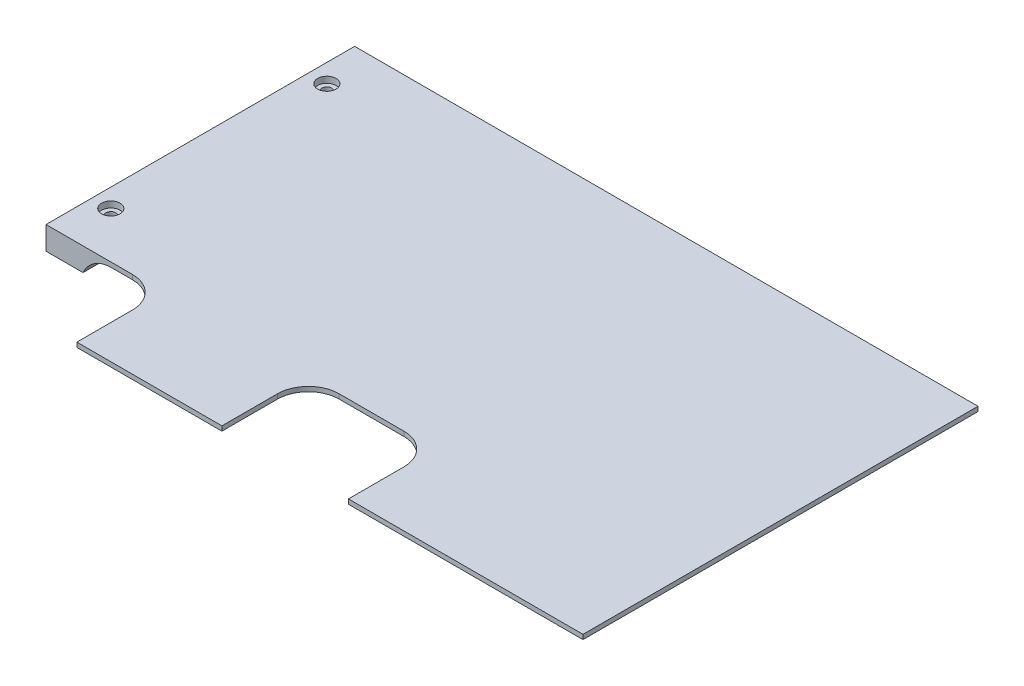
ISO-10303-21;
HEADER;
FILE_DESCRIPTION(('STEP AP214'),'2;1');
FILE_NAME('part.step','',(''),(''),'','','');
FILE_SCHEMA(('AUTOMOTIVE_DESIGN { 1 0 10303 214 1 1 1 1 }'));
ENDSEC;
DATA;
#1=APPLICATION_CONTEXT('core data for automotive mechanical design processes');
#2=APPLICATION_PROTOCOL_DEFINITION('international standard','automotive_design',2000,#1);
#3=PRODUCT_CONTEXT('',#1,'mechanical');
#4=PRODUCT('Part','Part','',(#3));
#5=PRODUCT_RELATED_PRODUCT_CATEGORY('part','',(#4));
#6=PRODUCT_DEFINITION_FORMATION('','',#4);
#7=PRODUCT_DEFINITION_CONTEXT('part definition',#1,'design');
#8=PRODUCT_DEFINITION('design','',#6,#7);
#9=PRODUCT_DEFINITION_SHAPE('','',#8);
#10=(LENGTH_UNIT() NAMED_UNIT(*) SI_UNIT(.MILLI.,.METRE.));
#11=(NAMED_UNIT(*) PLANE_ANGLE_UNIT() SI_UNIT($,.RADIAN.));
#12=(NAMED_UNIT(*) SI_UNIT($,.STERADIAN.) SOLID_ANGLE_UNIT());
#13=UNCERTAINTY_MEASURE_WITH_UNIT(LENGTH_MEASURE(1.E-05),#10,'distance_accuracy_value','');
#14=(GEOMETRIC_REPRESENTATION_CONTEXT(3) GLOBAL_UNCERTAINTY_ASSIGNED_CONTEXT((#13)) GLOBAL_UNIT_ASSIGNED_CONTEXT((#10,
#11,#12)) REPRESENTATION_CONTEXT('',''));
#15=CARTESIAN_POINT('',(0.,0.,0.));
#16=DIRECTION('',(0.,0.,1.));
#17=DIRECTION('',(1.,0.,0.));
#18=AXIS2_PLACEMENT_3D('',#15,#16,#17);
#19=CARTESIAN_POINT('',(5.99999999999995,-4.52548339959391,-15.));
#20=DIRECTION('',(0.,1.,0.));
#21=DIRECTION('',(0.,0.,1.));
#22=AXIS2_PLACEMENT_3D('',#19,#20,#21);
#23=CYLINDRICAL_SURFACE('',#22,1.6);
#24=CARTESIAN_POINT('',(5.99999999999995,-6.,-15.));
#25=DIRECTION('',(0.,-1.,0.));
#26=DIRECTION('',(0.,0.,-1.));
#27=AXIS2_PLACEMENT_3D('',#24,#25,#26);
#28=CIRCLE('',#27,1.6);
#29=CARTESIAN_POINT('',(5.99999999999995,-6.,-13.4));
#30=VERTEX_POINT('',#29);
#31=EDGE_CURVE('E204',#30,#30,#28,.T.);
#32=CARTESIAN_POINT('',(5.99999999999995,-0.5,-15.));
#33=DIRECTION('',(0.,1.,0.));
#34=DIRECTION('',(0.,0.,1.));
#35=AXIS2_PLACEMENT_3D('',#32,#33,#34);
#36=CIRCLE('',#35,1.6);
#37=CARTESIAN_POINT('',(5.99999999999995,-0.500000000000001,-13.4));
#38=VERTEX_POINT('',#37);
#39=EDGE_CURVE('E39',#38,#38,#36,.F.);
#40=CARTESIAN_POINT('',(5.99999999999995,-6.,-13.4));
#41=CARTESIAN_POINT('',(5.99999999999995,-5.94270833333333,-13.4));
#42=CARTESIAN_POINT('',(5.99999999999995,-5.88541666666667,-13.4));
#43=CARTESIAN_POINT('',(5.99999999999995,-5.77083333333333,-13.4));
#44=CARTESIAN_POINT('',(5.99999999999995,-5.71354166666667,-13.4));
#45=CARTESIAN_POINT('',(5.99999999999995,-5.59895833333333,-13.4));
#46=CARTESIAN_POINT('',(5.99999999999995,-5.54166666666667,-13.4));
#47=CARTESIAN_POINT('',(5.99999999999995,-5.42708333333333,-13.4));
#48=CARTESIAN_POINT('',(5.99999999999995,-5.36979166666667,-13.4));
#49=CARTESIAN_POINT('',(5.99999999999995,-5.25520833333333,-13.4));
#50=CARTESIAN_POINT('',(5.99999999999995,-5.19791666666667,-13.4));
#51=CARTESIAN_POINT('',(5.99999999999995,-5.08333333333333,-13.4));
#52=CARTESIAN_POINT('',(5.99999999999995,-5.02604166666667,-13.4));
#53=CARTESIAN_POINT('',(5.99999999999995,-4.91145833333333,-13.4));
#54=CARTESIAN_POINT('',(5.99999999999995,-4.85416666666667,-13.4));
#55=CARTESIAN_POINT('',(5.99999999999995,-4.73958333333333,-13.4));
#56=CARTESIAN_POINT('',(5.99999999999995,-4.68229166666667,-13.4));
#57=CARTESIAN_POINT('',(5.99999999999995,-4.56770833333333,-13.4));
#58=CARTESIAN_POINT('',(5.99999999999995,-4.51041666666667,-13.4));
#59=CARTESIAN_POINT('',(5.99999999999995,-4.39583333333333,-13.4));
#60=CARTESIAN_POINT('',(5.99999999999995,-4.33854166666667,-13.4));
#61=CARTESIAN_POINT('',(5.99999999999995,-4.22395833333333,-13.4));
#62=CARTESIAN_POINT('',(5.99999999999995,-4.16666666666667,-13.4));
#63=CARTESIAN_POINT('',(5.99999999999995,-4.05208333333333,-13.4));
#64=CARTESIAN_POINT('',(5.99999999999995,-3.99479166666667,-13.4));
#65=CARTESIAN_POINT('',(5.99999999999995,-3.88020833333333,-13.4));
#66=CARTESIAN_POINT('',(5.99999999999995,-3.82291666666667,-13.4));
#67=CARTESIAN_POINT('',(5.99999999999995,-3.70833333333333,-13.4));
#68=CARTESIAN_POINT('',(5.99999999999995,-3.65104166666667,-13.4));
#69=CARTESIAN_POINT('',(5.99999999999995,-3.53645833333333,-13.4));
#70=CARTESIAN_POINT('',(5.99999999999995,-3.47916666666667,-13.4));
#71=CARTESIAN_POINT('',(5.99999999999995,-3.36458333333333,-13.4));
#72=CARTESIAN_POINT('',(5.99999999999995,-3.30729166666667,-13.4));
#73=CARTESIAN_POINT('',(5.99999999999995,-3.19270833333333,-13.4));
#74=CARTESIAN_POINT('',(5.99999999999995,-3.13541666666667,-13.4));
#75=CARTESIAN_POINT('',(5.99999999999995,-3.02083333333333,-13.4));
#76=CARTESIAN_POINT('',(5.99999999999995,-2.96354166666667,-13.4));
#77=CARTESIAN_POINT('',(5.99999999999995,-2.84895833333333,-13.4));
#78=CARTESIAN_POINT('',(5.99999999999995,-2.79166666666667,-13.4));
#79=CARTESIAN_POINT('',(5.99999999999995,-2.67708333333333,-13.4));
#80=CARTESIAN_POINT('',(5.99999999999995,-2.61979166666667,-13.4));
#81=CARTESIAN_POINT('',(5.99999999999995,-2.50520833333333,-13.4));
#82=CARTESIAN_POINT('',(5.99999999999995,-2.44791666666667,-13.4));
#83=CARTESIAN_POINT('',(5.99999999999995,-2.33333333333333,-13.4));
#84=CARTESIAN_POINT('',(5.99999999999995,-2.27604166666667,-13.4));
#85=CARTESIAN_POINT('',(5.99999999999995,-2.16145833333333,-13.4));
#86=CARTESIAN_POINT('',(5.99999999999995,-2.10416666666667,-13.4));
#87=CARTESIAN_POINT('',(5.99999999999995,-1.98958333333333,-13.4));
#88=CARTESIAN_POINT('',(5.99999999999995,-1.93229166666667,-13.4));
#89=CARTESIAN_POINT('',(5.99999999999995,-1.81770833333333,-13.4));
#90=CARTESIAN_POINT('',(5.99999999999995,-1.76041666666667,-13.4));
#91=CARTESIAN_POINT('',(5.99999999999995,-1.64583333333333,-13.4));
#92=CARTESIAN_POINT('',(5.99999999999995,-1.58854166666667,-13.4));
#93=CARTESIAN_POINT('',(5.99999999999995,-1.47395833333333,-13.4));
#94=CARTESIAN_POINT('',(5.99999999999995,-1.41666666666667,-13.4));
#95=CARTESIAN_POINT('',(5.99999999999995,-1.30208333333333,-13.4));
#96=CARTESIAN_POINT('',(5.99999999999995,-1.24479166666667,-13.4));
#97=CARTESIAN_POINT('',(5.99999999999995,-1.13020833333333,-13.4));
#98=CARTESIAN_POINT('',(5.99999999999995,-1.07291666666667,-13.4));
#99=CARTESIAN_POINT('',(5.99999999999995,-0.958333333333334,-13.4));
#100=CARTESIAN_POINT('',(5.99999999999995,-0.901041666666667,-13.4));
#101=CARTESIAN_POINT('',(5.99999999999995,-0.786458333333334,-13.4));
#102=CARTESIAN_POINT('',(5.99999999999995,-0.729166666666667,-13.4));
#103=CARTESIAN_POINT('',(5.99999999999995,-0.614583333333334,-13.4));
#104=CARTESIAN_POINT('',(5.99999999999995,-0.557291666666668,-13.4));
#105=CARTESIAN_POINT('',(5.99999999999995,-0.500000000000001,-13.4));
#106=B_SPLINE_CURVE_WITH_KNOTS('',3,(#40,#41,#42,#43,#44,#45,#46,#47,#48,#49,#50,#51,#52,#53,
#54,#55,#56,#57,#58,#59,#60,#61,#62,#63,#64,#65,#66,#67,#68,#69,#70,#71,#72,#73,#74,#75,#76,#77,
#78,#79,#80,#81,#82,#83,#84,#85,#86,#87,#88,#89,#90,#91,#92,#93,#94,#95,#96,#97,#98,#99,#100,
#101,#102,#103,#104,#105),.UNSPECIFIED.,.F.,.F.,(4,2,2,2,2,2,2,2,2,2,2,2,2,2,2,2,2,2,2,2,2,2,2,
2,2,2,2,2,2,2,2,2,4),(0.,0.171874999999999,0.343749999999999,0.515625,0.6875,0.859375,1.03125,
1.203125,1.375,1.546875,1.71875,1.890625,2.0625,2.234375,2.40625,2.578125,2.75,2.921875,3.09375,
3.265625,3.4375,3.609375,3.78125,3.953125,4.125,4.296875,4.46875,4.640625,4.8125,4.984375,
5.15625,5.328125,5.5),.UNSPECIFIED.);
#107=EDGE_CURVE('BSEAM35',#30,#38,#106,.T.);
#108=ORIENTED_EDGE('',*,*,#31,.T.);
#109=ORIENTED_EDGE('',*,*,#39,.F.);
#110=ORIENTED_EDGE('',*,*,#107,.T.);
#111=ORIENTED_EDGE('',*,*,#107,.F.);
#112=EDGE_LOOP('',(#108,#110,#109,#111));
#113=FACE_BOUND('',#112,.T.);
#114=ADVANCED_FACE('F35',(#113),#23,.F.);
#115=CARTESIAN_POINT('',(5.99999999999995,-4.52548339959391,-85.));
#116=DIRECTION('',(0.,1.,0.));
#117=DIRECTION('',(0.,0.,1.));
#118=AXIS2_PLACEMENT_3D('',#115,#116,#117);
#119=CYLINDRICAL_SURFACE('',#118,1.6);
#120=CARTESIAN_POINT('',(5.99999999999995,-6.,-85.));
#121=DIRECTION('',(0.,-1.,0.));
#122=DIRECTION('',(0.,0.,-1.));
#123=AXIS2_PLACEMENT_3D('',#120,#121,#122);
#124=CIRCLE('',#123,1.60000000000001);
#125=CARTESIAN_POINT('',(5.99999999999995,-6.,-83.4));
#126=VERTEX_POINT('',#125);
#127=EDGE_CURVE('E201',#126,#126,#124,.T.);
#128=CARTESIAN_POINT('',(5.99999999999995,-0.5,-85.));
#129=DIRECTION('',(0.,1.,0.));
#130=DIRECTION('',(0.,0.,1.));
#131=AXIS2_PLACEMENT_3D('',#128,#129,#130);
#132=CIRCLE('',#131,1.6);
#133=CARTESIAN_POINT('',(5.99999999999995,-0.500000000000001,-83.4));
#134=VERTEX_POINT('',#133);
#135=EDGE_CURVE('E266',#134,#134,#132,.F.);
#136=CARTESIAN_POINT('',(5.99999999999995,-6.,-83.4));
#137=CARTESIAN_POINT('',(5.99999999999995,-5.94270833333333,-83.4));
#138=CARTESIAN_POINT('',(5.99999999999995,-5.88541666666667,-83.4));
#139=CARTESIAN_POINT('',(5.99999999999995,-5.77083333333333,-83.4));
#140=CARTESIAN_POINT('',(5.99999999999995,-5.71354166666667,-83.4));
#141=CARTESIAN_POINT('',(5.99999999999995,-5.59895833333333,-83.4));
#142=CARTESIAN_POINT('',(5.99999999999995,-5.54166666666667,-83.4));
#143=CARTESIAN_POINT('',(5.99999999999995,-5.42708333333333,-83.4));
#144=CARTESIAN_POINT('',(5.99999999999995,-5.36979166666667,-83.4));
#145=CARTESIAN_POINT('',(5.99999999999995,-5.25520833333333,-83.4));
#146=CARTESIAN_POINT('',(5.99999999999995,-5.19791666666667,-83.4));
#147=CARTESIAN_POINT('',(5.99999999999995,-5.08333333333333,-83.4));
#148=CARTESIAN_POINT('',(5.99999999999995,-5.02604166666667,-83.4));
#149=CARTESIAN_POINT('',(5.99999999999995,-4.91145833333333,-83.4));
#150=CARTESIAN_POINT('',(5.99999999999995,-4.85416666666667,-83.4));
#151=CARTESIAN_POINT('',(5.99999999999995,-4.73958333333333,-83.4));
#152=CARTESIAN_POINT('',(5.99999999999995,-4.68229166666667,-83.4));
#153=CARTESIAN_POINT('',(5.99999999999995,-4.56770833333333,-83.4));
#154=CARTESIAN_POINT('',(5.99999999999995,-4.51041666666667,-83.4));
#155=CARTESIAN_POINT('',(5.99999999999995,-4.39583333333333,-83.4));
#156=CARTESIAN_POINT('',(5.99999999999995,-4.33854166666667,-83.4));
#157=CARTESIAN_POINT('',(5.99999999999995,-4.22395833333333,-83.4));
#158=CARTESIAN_POINT('',(5.99999999999995,-4.16666666666667,-83.4));
#159=CARTESIAN_POINT('',(5.99999999999995,-4.05208333333333,-83.4));
#160=CARTESIAN_POINT('',(5.99999999999995,-3.99479166666667,-83.4));
#161=CARTESIAN_POINT('',(5.99999999999995,-3.88020833333333,-83.4));
#162=CARTESIAN_POINT('',(5.99999999999995,-3.82291666666667,-83.4));
#163=CARTESIAN_POINT('',(5.99999999999995,-3.70833333333333,-83.4));
#164=CARTESIAN_POINT('',(5.99999999999995,-3.65104166666667,-83.4));
#165=CARTESIAN_POINT('',(5.99999999999995,-3.53645833333333,-83.4));
#166=CARTESIAN_POINT('',(5.99999999999995,-3.47916666666667,-83.4));
#167=CARTESIAN_POINT('',(5.99999999999995,-3.36458333333333,-83.4));
#168=CARTESIAN_POINT('',(5.99999999999995,-3.30729166666667,-83.4));
#169=CARTESIAN_POINT('',(5.99999999999995,-3.19270833333333,-83.4));
#170=CARTESIAN_POINT('',(5.99999999999995,-3.13541666666667,-83.4));
#171=CARTESIAN_POINT('',(5.99999999999995,-3.02083333333333,-83.4));
#172=CARTESIAN_POINT('',(5.99999999999995,-2.96354166666667,-83.4));
#173=CARTESIAN_POINT('',(5.99999999999995,-2.84895833333333,-83.4));
#174=CARTESIAN_POINT('',(5.99999999999995,-2.79166666666667,-83.4));
#175=CARTESIAN_POINT('',(5.99999999999995,-2.67708333333333,-83.4));
#176=CARTESIAN_POINT('',(5.99999999999995,-2.61979166666667,-83.4));
#177=CARTESIAN_POINT('',(5.99999999999995,-2.50520833333333,-83.4));
#178=CARTESIAN_POINT('',(5.99999999999995,-2.44791666666667,-83.4));
#179=CARTESIAN_POINT('',(5.99999999999995,-2.33333333333333,-83.4));
#180=CARTESIAN_POINT('',(5.99999999999995,-2.27604166666667,-83.4));
#181=CARTESIAN_POINT('',(5.99999999999995,-2.16145833333333,-83.4));
#182=CARTESIAN_POINT('',(5.99999999999995,-2.10416666666667,-83.4));
#183=CARTESIAN_POINT('',(5.99999999999995,-1.98958333333333,-83.4));
#184=CARTESIAN_POINT('',(5.99999999999995,-1.93229166666667,-83.4));
#185=CARTESIAN_POINT('',(5.99999999999995,-1.81770833333333,-83.4));
#186=CARTESIAN_POINT('',(5.99999999999995,-1.76041666666667,-83.4));
#187=CARTESIAN_POINT('',(5.99999999999995,-1.64583333333333,-83.4));
#188=CARTESIAN_POINT('',(5.99999999999995,-1.58854166666667,-83.4));
#189=CARTESIAN_POINT('',(5.99999999999995,-1.47395833333333,-83.4));
#190=CARTESIAN_POINT('',(5.99999999999995,-1.41666666666667,-83.4));
#191=CARTESIAN_POINT('',(5.99999999999995,-1.30208333333333,-83.4));
#192=CARTESIAN_POINT('',(5.99999999999995,-1.24479166666667,-83.4));
#193=CARTESIAN_POINT('',(5.99999999999995,-1.13020833333333,-83.4));
#194=CARTESIAN_POINT('',(5.99999999999995,-1.07291666666667,-83.4));
#195=CARTESIAN_POINT('',(5.99999999999995,-0.958333333333334,-83.4));
#196=CARTESIAN_POINT('',(5.99999999999995,-0.901041666666667,-83.4));
#197=CARTESIAN_POINT('',(5.99999999999995,-0.786458333333334,-83.4));
#198=CARTESIAN_POINT('',(5.99999999999995,-0.729166666666667,-83.4));
#199=CARTESIAN_POINT('',(5.99999999999995,-0.614583333333334,-83.4));
#200=CARTESIAN_POINT('',(5.99999999999995,-0.557291666666668,-83.4));
#201=CARTESIAN_POINT('',(5.99999999999995,-0.500000000000001,-83.4));
#202=B_SPLINE_CURVE_WITH_KNOTS('',3,(#136,#137,#138,#139,#140,#141,#142,#143,#144,#145,#146,
#147,#148,#149,#150,#151,#152,#153,#154,#155,#156,#157,#158,#159,#160,#161,#162,#163,#164,#165,
#166,#167,#168,#169,#170,#171,#172,#173,#174,#175,#176,#177,#178,#179,#180,#181,#182,#183,#184,
#185,#186,#187,#188,#189,#190,#191,#192,#193,#194,#195,#196,#197,#198,#199,#200,#201),
.UNSPECIFIED.,.F.,.F.,(4,2,2,2,2,2,2,2,2,2,2,2,2,2,2,2,2,2,2,2,2,2,2,2,2,2,2,2,2,2,2,2,4),(0.,
0.171874999999999,0.343749999999999,0.515625,0.6875,0.859375,1.03125,1.203125,1.375,1.546875,
1.71875,1.890625,2.0625,2.234375,2.40625,2.578125,2.75,2.921875,3.09375,3.265625,3.4375,
3.609375,3.78125,3.953125,4.125,4.296875,4.46875,4.640625,4.8125,4.984375,5.15625,5.328125,5.5),.UNSPECIFIED.);
#203=EDGE_CURVE('BSEAM304',#126,#134,#202,.T.);
#204=ORIENTED_EDGE('',*,*,#127,.T.);
#205=ORIENTED_EDGE('',*,*,#135,.F.);
#206=ORIENTED_EDGE('',*,*,#203,.T.);
#207=ORIENTED_EDGE('',*,*,#203,.F.);
#208=EDGE_LOOP('',(#204,#206,#205,#207));
#209=FACE_BOUND('',#208,.T.);
#210=ADVANCED_FACE('F304',(#209),#119,.F.);
#211=CARTESIAN_POINT('',(0.,1.5,0.));
#212=DIRECTION('',(0.,0.,-1.));
#213=DIRECTION('',(-1.,0.,0.));
#214=AXIS2_PLACEMENT_3D('',#211,#212,#213);
#215=PLANE('',#214);
#216=DIRECTION('',(1.,0.,0.));
#217=VECTOR('',#216,1.);
#218=CARTESIAN_POINT('',(0.,1.5,0.));
#219=LINE('',#218,#217);
#220=CARTESIAN_POINT('',(94.9999999999999,1.5,0.));
#221=VERTEX_POINT('',#220);
#222=CARTESIAN_POINT('',(116.,1.5,0.));
#223=VERTEX_POINT('',#222);
#224=EDGE_CURVE('E222',#221,#223,#219,.T.);
#225=ORIENTED_EDGE('',*,*,#224,.F.);
#226=DIRECTION('',(0.,1.,0.));
#227=VECTOR('',#226,1.);
#228=CARTESIAN_POINT('',(94.9999999999999,1.5,0.));
#229=LINE('',#228,#227);
#230=CARTESIAN_POINT('',(94.9999999999999,0.,0.));
#231=VERTEX_POINT('',#230);
#232=EDGE_CURVE('E248',#221,#231,#229,.F.);
#233=ORIENTED_EDGE('',*,*,#232,.T.);
#234=DIRECTION('',(1.,0.,0.));
#235=VECTOR('',#234,1.);
#236=CARTESIAN_POINT('',(0.,0.,0.));
#237=LINE('',#236,#235);
#238=CARTESIAN_POINT('',(116.,0.,0.));
#239=VERTEX_POINT('',#238);
#240=EDGE_CURVE('E219',#231,#239,#237,.T.);
#241=ORIENTED_EDGE('',*,*,#240,.T.);
#242=DIRECTION('',(0.,1.,0.));
#243=VECTOR('',#242,1.);
#244=CARTESIAN_POINT('',(116.,1.5,0.));
#245=LINE('',#244,#243);
#246=EDGE_CURVE('E245',#239,#223,#245,.T.);
#247=ORIENTED_EDGE('',*,*,#246,.T.);
#248=EDGE_LOOP('',(#225,#233,#241,#247));
#249=FACE_BOUND('',#248,.T.);
#250=ADVANCED_FACE('F309',(#249),#215,.F.);
#251=CARTESIAN_POINT('',(0.,1.5,0.));
#252=DIRECTION('',(1.,0.,0.));
#253=DIRECTION('',(0.,0.,-1.));
#254=AXIS2_PLACEMENT_3D('',#251,#252,#253);
#255=PLANE('',#254);
#256=DIRECTION('',(0.,-1.,0.));
#257=VECTOR('',#256,1.);
#258=CARTESIAN_POINT('',(0.,1.5,-100.));
#259=LINE('',#258,#257);
#260=CARTESIAN_POINT('',(0.,1.5,-100.));
#261=VERTEX_POINT('',#260);
#262=CARTESIAN_POINT('',(0.,-6.,-100.));
#263=VERTEX_POINT('',#262);
#264=EDGE_CURVE('E227',#261,#263,#259,.T.);
#265=ORIENTED_EDGE('',*,*,#264,.T.);
#266=DIRECTION('',(0.,0.,-1.));
#267=VECTOR('',#266,1.);
#268=CARTESIAN_POINT('',(0.,-6.,-100.));
#269=LINE('',#268,#267);
#270=CARTESIAN_POINT('',(0.,-6.,0.));
#271=VERTEX_POINT('',#270);
#272=EDGE_CURVE('E207',#271,#263,#269,.T.);
#273=ORIENTED_EDGE('',*,*,#272,.F.);
#274=DIRECTION('',(0.,-1.,0.));
#275=VECTOR('',#274,1.);
#276=CARTESIAN_POINT('',(0.,1.5,0.));
#277=LINE('',#276,#275);
#278=CARTESIAN_POINT('',(0.,1.5,0.));
#279=VERTEX_POINT('',#278);
#280=EDGE_CURVE('E235',#279,#271,#277,.T.);
#281=ORIENTED_EDGE('',*,*,#280,.F.);
#282=DIRECTION('',(0.,0.,1.));
#283=VECTOR('',#282,1.);
#284=CARTESIAN_POINT('',(0.,1.5,0.));
#285=LINE('',#284,#283);
#286=EDGE_CURVE('E220',#261,#279,#285,.T.);
#287=ORIENTED_EDGE('',*,*,#286,.F.);
#288=EDGE_LOOP('',(#265,#273,#281,#287));
#289=FACE_BOUND('',#288,.T.);
#290=ADVANCED_FACE('F366',(#289),#255,.F.);
#291=DIRECTION('',(-1.,0.,0.));
#292=VECTOR('',#291,1.);
#293=CARTESIAN_POINT('',(0.,-6.,0.));
#294=LINE('',#293,#292);
#295=CARTESIAN_POINT('',(11.9999999999999,-6.,0.));
#296=VERTEX_POINT('',#295);
#297=EDGE_CURVE('E216',#296,#271,#294,.T.);
#298=ORIENTED_EDGE('',*,*,#297,.F.);
#299=CARTESIAN_POINT('',(21.1651513899116,-10.,0.));
#300=DIRECTION('',(0.,0.,-1.));
#301=DIRECTION('',(-1.,0.,0.));
#302=AXIS2_PLACEMENT_3D('',#299,#300,#301);
#303=CIRCLE('',#302,10.);
#304=CARTESIAN_POINT('',(21.1651513899116,0.,0.));
#305=VERTEX_POINT('',#304);
#306=EDGE_CURVE('E44',#296,#305,#303,.T.);
#307=ORIENTED_EDGE('',*,*,#306,.T.);
#308=CARTESIAN_POINT('',(27.9999999999999,0.,0.));
#309=VERTEX_POINT('',#308);
#310=EDGE_CURVE('E228',#305,#309,#237,.T.);
#311=ORIENTED_EDGE('',*,*,#310,.T.);
#312=DIRECTION('',(0.,1.,0.));
#313=VECTOR('',#312,1.);
#314=CARTESIAN_POINT('',(27.9999999999999,1.5,0.));
#315=LINE('',#314,#313);
#316=CARTESIAN_POINT('',(27.9999999999999,1.5,0.));
#317=VERTEX_POINT('',#316);
#318=EDGE_CURVE('E237',#309,#317,#315,.T.);
#319=ORIENTED_EDGE('',*,*,#318,.T.);
#320=EDGE_CURVE('E154',#279,#317,#219,.T.);
#321=ORIENTED_EDGE('',*,*,#320,.F.);
#322=ORIENTED_EDGE('',*,*,#280,.T.);
#323=EDGE_LOOP('',(#298,#307,#311,#319,#321,#322));
#324=FACE_BOUND('',#323,.T.);
#325=ADVANCED_FACE('F369',(#324),#215,.F.);
#326=CARTESIAN_POINT('',(202.,1.5,0.));
#327=DIRECTION('',(-1.,0.,0.));
#328=DIRECTION('',(0.,0.,1.));
#329=AXIS2_PLACEMENT_3D('',#326,#327,#328);
#330=PLANE('',#329);
#331=DIRECTION('',(0.,0.,-1.));
#332=VECTOR('',#331,1.);
#333=CARTESIAN_POINT('',(202.,0.,0.));
#334=LINE('',#333,#332);
#335=CARTESIAN_POINT('',(202.,0.,28.));
#336=VERTEX_POINT('',#335);
#337=CARTESIAN_POINT('',(202.,0.,-100.));
#338=VERTEX_POINT('',#337);
#339=EDGE_CURVE('E230',#336,#338,#334,.T.);
#340=ORIENTED_EDGE('',*,*,#339,.T.);
#341=DIRECTION('',(0.,-1.,0.));
#342=VECTOR('',#341,1.);
#343=CARTESIAN_POINT('',(202.,1.5,-100.));
#344=LINE('',#343,#342);
#345=CARTESIAN_POINT('',(202.,1.5,-100.));
#346=VERTEX_POINT('',#345);
#347=EDGE_CURVE('E149',#346,#338,#344,.T.);
#348=ORIENTED_EDGE('',*,*,#347,.F.);
#349=DIRECTION('',(0.,0.,-1.));
#350=VECTOR('',#349,1.);
#351=CARTESIAN_POINT('',(202.,1.5,0.));
#352=LINE('',#351,#350);
#353=CARTESIAN_POINT('',(202.,1.5,28.));
#354=VERTEX_POINT('',#353);
#355=EDGE_CURVE('E143',#354,#346,#352,.T.);
#356=ORIENTED_EDGE('',*,*,#355,.F.);
#357=DIRECTION('',(0.,1.,0.));
#358=VECTOR('',#357,1.);
#359=CARTESIAN_POINT('',(202.,-80.9938269252663,28.));
#360=LINE('',#359,#358);
#361=EDGE_CURVE('E146',#336,#354,#360,.T.);
#362=ORIENTED_EDGE('',*,*,#361,.F.);
#363=EDGE_LOOP('',(#340,#348,#356,#362));
#364=FACE_BOUND('',#363,.T.);
#365=ADVANCED_FACE('F145',(#364),#330,.F.);
#366=CARTESIAN_POINT('',(0.,1.5,-100.));
#367=DIRECTION('',(0.,0.,1.));
#368=DIRECTION('',(1.,0.,0.));
#369=AXIS2_PLACEMENT_3D('',#366,#367,#368);
#370=PLANE('',#369);
#371=DIRECTION('',(-1.,0.,0.));
#372=VECTOR('',#371,1.);
#373=CARTESIAN_POINT('',(0.,0.,-100.));
#374=LINE('',#373,#372);
#375=CARTESIAN_POINT('',(21.1651513899116,0.,-100.));
#376=VERTEX_POINT('',#375);
#377=EDGE_CURVE('E223',#338,#376,#374,.T.);
#378=ORIENTED_EDGE('',*,*,#377,.T.);
#379=CARTESIAN_POINT('',(21.1651513899116,-10.,-100.));
#380=DIRECTION('',(0.,0.,1.));
#381=DIRECTION('',(1.,0.,0.));
#382=AXIS2_PLACEMENT_3D('',#379,#380,#381);
#383=CIRCLE('',#382,10.);
#384=CARTESIAN_POINT('',(11.9999999999999,-6.,-100.));
#385=VERTEX_POINT('',#384);
#386=EDGE_CURVE('E11',#376,#385,#383,.T.);
#387=ORIENTED_EDGE('',*,*,#386,.T.);
#388=DIRECTION('',(1.,0.,0.));
#389=VECTOR('',#388,1.);
#390=CARTESIAN_POINT('',(0.,-6.,-100.));
#391=LINE('',#390,#389);
#392=EDGE_CURVE('E210',#263,#385,#391,.T.);
#393=ORIENTED_EDGE('',*,*,#392,.F.);
#394=ORIENTED_EDGE('',*,*,#264,.F.);
#395=DIRECTION('',(-1.,0.,0.));
#396=VECTOR('',#395,1.);
#397=CARTESIAN_POINT('',(0.,1.5,-100.));
#398=LINE('',#397,#396);
#399=EDGE_CURVE('E153',#346,#261,#398,.T.);
#400=ORIENTED_EDGE('',*,*,#399,.F.);
#401=ORIENTED_EDGE('',*,*,#347,.T.);
#402=EDGE_LOOP('',(#378,#387,#393,#394,#400,#401));
#403=FACE_BOUND('',#402,.T.);
#404=ADVANCED_FACE('F290',(#403),#370,.F.);
#405=CARTESIAN_POINT('',(0.,1.5,0.));
#406=DIRECTION('',(0.,-1.,0.));
#407=DIRECTION('',(0.,0.,-1.));
#408=AXIS2_PLACEMENT_3D('',#405,#406,#407);
#409=PLANE('',#408);
#410=CARTESIAN_POINT('',(5.99999999999995,1.5,-85.));
#411=DIRECTION('',(0.,1.,0.));
#412=DIRECTION('',(0.,0.,1.));
#413=AXIS2_PLACEMENT_3D('',#410,#411,#412);
#414=CIRCLE('',#413,3.);
#415=CARTESIAN_POINT('',(5.99999999999995,1.5,-82.));
#416=VERTEX_POINT('',#415);
#417=EDGE_CURVE('E273',#416,#416,#414,.T.);
#418=ORIENTED_EDGE('',*,*,#417,.F.);
#419=EDGE_LOOP('',(#418));
#420=FACE_BOUND('',#419,.T.);
#421=CARTESIAN_POINT('',(5.99999999999995,1.5,-15.));
#422=DIRECTION('',(0.,1.,0.));
#423=DIRECTION('',(0.,0.,1.));
#424=AXIS2_PLACEMENT_3D('',#421,#422,#423);
#425=CIRCLE('',#424,3.);
#426=CARTESIAN_POINT('',(5.99999999999995,1.5,-12.));
#427=VERTEX_POINT('',#426);
#428=EDGE_CURVE('E176',#427,#427,#425,.T.);
#429=ORIENTED_EDGE('',*,*,#428,.F.);
#430=EDGE_LOOP('',(#429));
#431=FACE_BOUND('',#430,.T.);
#432=ORIENTED_EDGE('',*,*,#286,.T.);
#433=ORIENTED_EDGE('',*,*,#320,.T.);
#434=CARTESIAN_POINT('',(27.9999999999999,1.5,10.));
#435=DIRECTION('',(0.,-1.,0.));
#436=DIRECTION('',(0.,0.,-1.));
#437=AXIS2_PLACEMENT_3D('',#434,#435,#436);
#438=CIRCLE('',#437,10.);
#439=CARTESIAN_POINT('',(37.9999999999999,1.5,10.));
#440=VERTEX_POINT('',#439);
#441=EDGE_CURVE('E252',#317,#440,#438,.T.);
#442=ORIENTED_EDGE('',*,*,#441,.T.);
#443=DIRECTION('',(0.,0.,1.));
#444=VECTOR('',#443,1.);
#445=CARTESIAN_POINT('',(37.9999999999999,1.5,0.));
#446=LINE('',#445,#444);
#447=CARTESIAN_POINT('',(37.9999999999999,1.5,28.));
#448=VERTEX_POINT('',#447);
#449=EDGE_CURVE('E163',#440,#448,#446,.T.);
#450=ORIENTED_EDGE('',*,*,#449,.T.);
#451=DIRECTION('',(1.,0.,0.));
#452=VECTOR('',#451,1.);
#453=CARTESIAN_POINT('',(37.9999999999999,1.5,28.));
#454=LINE('',#453,#452);
#455=CARTESIAN_POINT('',(84.9999999999999,1.5,28.));
#456=VERTEX_POINT('',#455);
#457=EDGE_CURVE('E185',#448,#456,#454,.T.);
#458=ORIENTED_EDGE('',*,*,#457,.T.);
#459=DIRECTION('',(0.,0.,-1.));
#460=VECTOR('',#459,1.);
#461=CARTESIAN_POINT('',(84.9999999999999,1.5,0.));
#462=LINE('',#461,#460);
#463=CARTESIAN_POINT('',(84.9999999999999,1.5,10.));
#464=VERTEX_POINT('',#463);
#465=EDGE_CURVE('E181',#456,#464,#462,.T.);
#466=ORIENTED_EDGE('',*,*,#465,.T.);
#467=CARTESIAN_POINT('',(94.9999999999999,1.5,10.));
#468=DIRECTION('',(0.,-1.,0.));
#469=DIRECTION('',(0.,0.,-1.));
#470=AXIS2_PLACEMENT_3D('',#467,#468,#469);
#471=CIRCLE('',#470,10.);
#472=EDGE_CURVE('E257',#464,#221,#471,.T.);
#473=ORIENTED_EDGE('',*,*,#472,.T.);
#474=ORIENTED_EDGE('',*,*,#224,.T.);
#475=CARTESIAN_POINT('',(116.,1.5,10.));
#476=DIRECTION('',(0.,-1.,0.));
#477=DIRECTION('',(0.,0.,-1.));
#478=AXIS2_PLACEMENT_3D('',#475,#476,#477);
#479=CIRCLE('',#478,10.);
#480=CARTESIAN_POINT('',(126.,1.5,10.));
#481=VERTEX_POINT('',#480);
#482=EDGE_CURVE('E261',#223,#481,#479,.T.);
#483=ORIENTED_EDGE('',*,*,#482,.T.);
#484=DIRECTION('',(0.,0.,1.));
#485=VECTOR('',#484,1.);
#486=CARTESIAN_POINT('',(126.,1.5,0.));
#487=LINE('',#486,#485);
#488=CARTESIAN_POINT('',(126.,1.5,28.));
#489=VERTEX_POINT('',#488);
#490=EDGE_CURVE('E168',#481,#489,#487,.T.);
#491=ORIENTED_EDGE('',*,*,#490,.T.);
#492=DIRECTION('',(1.,0.,0.));
#493=VECTOR('',#492,1.);
#494=CARTESIAN_POINT('',(202.,1.5,28.));
#495=LINE('',#494,#493);
#496=EDGE_CURVE('E160',#489,#354,#495,.T.);
#497=ORIENTED_EDGE('',*,*,#496,.T.);
#498=ORIENTED_EDGE('',*,*,#355,.T.);
#499=ORIENTED_EDGE('',*,*,#399,.T.);
#500=EDGE_LOOP('',(#432,#433,#442,#450,#458,#466,#473,#474,#483,#491,#497,#498,#499));
#501=FACE_BOUND('',#500,.T.);
#502=ADVANCED_FACE('F166',(#420,#431,#501),#409,.F.);
#503=CARTESIAN_POINT('',(0.,0.,0.));
#504=DIRECTION('',(0.,-1.,0.));
#505=DIRECTION('',(0.,0.,-1.));
#506=AXIS2_PLACEMENT_3D('',#503,#504,#505);
#507=PLANE('',#506);
#508=ORIENTED_EDGE('',*,*,#310,.F.);
#509=DIRECTION('',(0.,0.,1.));
#510=VECTOR('',#509,1.);
#511=CARTESIAN_POINT('',(21.1651513899116,0.,-100.));
#512=LINE('',#511,#510);
#513=EDGE_CURVE('E58',#305,#376,#512,.F.);
#514=ORIENTED_EDGE('',*,*,#513,.T.);
#515=ORIENTED_EDGE('',*,*,#377,.F.);
#516=ORIENTED_EDGE('',*,*,#339,.F.);
#517=DIRECTION('',(1.,0.,0.));
#518=VECTOR('',#517,1.);
#519=CARTESIAN_POINT('',(202.,0.,28.));
#520=LINE('',#519,#518);
#521=CARTESIAN_POINT('',(126.,0.,28.));
#522=VERTEX_POINT('',#521);
#523=EDGE_CURVE('E162',#522,#336,#520,.T.);
#524=ORIENTED_EDGE('',*,*,#523,.F.);
#525=DIRECTION('',(0.,0.,1.));
#526=VECTOR('',#525,1.);
#527=CARTESIAN_POINT('',(126.,0.,0.));
#528=LINE('',#527,#526);
#529=CARTESIAN_POINT('',(126.,0.,10.));
#530=VERTEX_POINT('',#529);
#531=EDGE_CURVE('E170',#530,#522,#528,.T.);
#532=ORIENTED_EDGE('',*,*,#531,.F.);
#533=CARTESIAN_POINT('',(116.,0.,10.));
#534=DIRECTION('',(0.,-1.,0.));
#535=DIRECTION('',(0.,0.,-1.));
#536=AXIS2_PLACEMENT_3D('',#533,#534,#535);
#537=CIRCLE('',#536,10.);
#538=EDGE_CURVE('E263',#530,#239,#537,.F.);
#539=ORIENTED_EDGE('',*,*,#538,.T.);
#540=ORIENTED_EDGE('',*,*,#240,.F.);
#541=CARTESIAN_POINT('',(94.9999999999999,0.,10.));
#542=DIRECTION('',(0.,-1.,0.));
#543=DIRECTION('',(0.,0.,-1.));
#544=AXIS2_PLACEMENT_3D('',#541,#542,#543);
#545=CIRCLE('',#544,10.);
#546=CARTESIAN_POINT('',(84.9999999999999,0.,10.));
#547=VERTEX_POINT('',#546);
#548=EDGE_CURVE('E259',#231,#547,#545,.F.);
#549=ORIENTED_EDGE('',*,*,#548,.T.);
#550=DIRECTION('',(0.,0.,-1.));
#551=VECTOR('',#550,1.);
#552=CARTESIAN_POINT('',(84.9999999999999,0.,0.));
#553=LINE('',#552,#551);
#554=CARTESIAN_POINT('',(84.9999999999999,0.,28.));
#555=VERTEX_POINT('',#554);
#556=EDGE_CURVE('E195',#555,#547,#553,.T.);
#557=ORIENTED_EDGE('',*,*,#556,.F.);
#558=DIRECTION('',(1.,0.,0.));
#559=VECTOR('',#558,1.);
#560=CARTESIAN_POINT('',(37.9999999999999,0.,28.));
#561=LINE('',#560,#559);
#562=CARTESIAN_POINT('',(37.9999999999999,0.,28.));
#563=VERTEX_POINT('',#562);
#564=EDGE_CURVE('E184',#563,#555,#561,.T.);
#565=ORIENTED_EDGE('',*,*,#564,.F.);
#566=DIRECTION('',(0.,0.,1.));
#567=VECTOR('',#566,1.);
#568=CARTESIAN_POINT('',(37.9999999999999,0.,0.));
#569=LINE('',#568,#567);
#570=CARTESIAN_POINT('',(37.9999999999999,0.,10.));
#571=VERTEX_POINT('',#570);
#572=EDGE_CURVE('E192',#571,#563,#569,.T.);
#573=ORIENTED_EDGE('',*,*,#572,.F.);
#574=CARTESIAN_POINT('',(27.9999999999999,0.,10.));
#575=DIRECTION('',(0.,-1.,0.));
#576=DIRECTION('',(0.,0.,-1.));
#577=AXIS2_PLACEMENT_3D('',#574,#575,#576);
#578=CIRCLE('',#577,10.);
#579=EDGE_CURVE('E254',#571,#309,#578,.F.);
#580=ORIENTED_EDGE('',*,*,#579,.T.);
#581=EDGE_LOOP('',(#508,#514,#515,#516,#524,#532,#539,#540,#549,#557,#565,#573,#580));
#582=FACE_BOUND('',#581,.T.);
#583=ADVANCED_FACE('F289',(#582),#507,.T.);
#584=CARTESIAN_POINT('',(0.,-6.,0.));
#585=DIRECTION('',(0.,1.,0.));
#586=DIRECTION('',(0.,0.,1.));
#587=AXIS2_PLACEMENT_3D('',#584,#585,#586);
#588=PLANE('',#587);
#589=ORIENTED_EDGE('',*,*,#272,.T.);
#590=ORIENTED_EDGE('',*,*,#392,.T.);
#591=DIRECTION('',(0.,0.,1.));
#592=VECTOR('',#591,1.);
#593=CARTESIAN_POINT('',(11.9999999999999,-6.,-100.));
#594=LINE('',#593,#592);
#595=EDGE_CURVE('E213',#385,#296,#594,.T.);
#596=ORIENTED_EDGE('',*,*,#595,.T.);
#597=ORIENTED_EDGE('',*,*,#297,.T.);
#598=EDGE_LOOP('',(#589,#590,#596,#597));
#599=FACE_BOUND('',#598,.T.);
#600=ORIENTED_EDGE('',*,*,#31,.F.);
#601=EDGE_LOOP('',(#600));
#602=FACE_BOUND('',#601,.T.);
#603=ORIENTED_EDGE('',*,*,#127,.F.);
#604=EDGE_LOOP('',(#603));
#605=FACE_BOUND('',#604,.T.);
#606=ADVANCED_FACE('F297',(#599,#602,#605),#588,.F.);
#607=CARTESIAN_POINT('',(37.9999999999999,-80.9938269252663,28.));
#608=DIRECTION('',(0.,0.,1.));
#609=DIRECTION('',(1.,0.,0.));
#610=AXIS2_PLACEMENT_3D('',#607,#608,#609);
#611=PLANE('',#610);
#612=DIRECTION('',(0.,1.,0.));
#613=VECTOR('',#612,1.);
#614=CARTESIAN_POINT('',(37.9999999999999,-80.9938269252663,28.));
#615=LINE('',#614,#613);
#616=EDGE_CURVE('E194',#563,#448,#615,.T.);
#617=ORIENTED_EDGE('',*,*,#616,.F.);
#618=ORIENTED_EDGE('',*,*,#564,.T.);
#619=DIRECTION('',(0.,1.,0.));
#620=VECTOR('',#619,1.);
#621=CARTESIAN_POINT('',(84.9999999999999,-80.9938269252663,28.));
#622=LINE('',#621,#620);
#623=EDGE_CURVE('E191',#555,#456,#622,.T.);
#624=ORIENTED_EDGE('',*,*,#623,.T.);
#625=ORIENTED_EDGE('',*,*,#457,.F.);
#626=EDGE_LOOP('',(#617,#618,#624,#625));
#627=FACE_BOUND('',#626,.T.);
#628=ADVANCED_FACE('F316',(#627),#611,.T.);
#629=CARTESIAN_POINT('',(84.9999999999999,-80.9938269252663,0.));
#630=DIRECTION('',(1.,0.,0.));
#631=DIRECTION('',(0.,0.,-1.));
#632=AXIS2_PLACEMENT_3D('',#629,#630,#631);
#633=PLANE('',#632);
#634=ORIENTED_EDGE('',*,*,#556,.T.);
#635=DIRECTION('',(0.,1.,0.));
#636=VECTOR('',#635,1.);
#637=CARTESIAN_POINT('',(84.9999999999999,-80.9938269252663,10.));
#638=LINE('',#637,#636);
#639=EDGE_CURVE('E242',#547,#464,#638,.T.);
#640=ORIENTED_EDGE('',*,*,#639,.T.);
#641=ORIENTED_EDGE('',*,*,#465,.F.);
#642=ORIENTED_EDGE('',*,*,#623,.F.);
#643=EDGE_LOOP('',(#634,#640,#641,#642));
#644=FACE_BOUND('',#643,.T.);
#645=ADVANCED_FACE('F320',(#644),#633,.T.);
#646=CARTESIAN_POINT('',(37.9999999999999,-80.9938269252663,0.));
#647=DIRECTION('',(-1.,0.,0.));
#648=DIRECTION('',(0.,0.,1.));
#649=AXIS2_PLACEMENT_3D('',#646,#647,#648);
#650=PLANE('',#649);
#651=ORIENTED_EDGE('',*,*,#449,.F.);
#652=DIRECTION('',(0.,1.,0.));
#653=VECTOR('',#652,1.);
#654=CARTESIAN_POINT('',(37.9999999999999,-80.9938269252663,10.));
#655=LINE('',#654,#653);
#656=EDGE_CURVE('E240',#440,#571,#655,.F.);
#657=ORIENTED_EDGE('',*,*,#656,.T.);
#658=ORIENTED_EDGE('',*,*,#572,.T.);
#659=ORIENTED_EDGE('',*,*,#616,.T.);
#660=EDGE_LOOP('',(#651,#657,#658,#659));
#661=FACE_BOUND('',#660,.T.);
#662=ADVANCED_FACE('F324',(#661),#650,.T.);
#663=CARTESIAN_POINT('',(126.,-80.9938269252663,0.));
#664=DIRECTION('',(-1.,0.,0.));
#665=DIRECTION('',(0.,0.,1.));
#666=AXIS2_PLACEMENT_3D('',#663,#664,#665);
#667=PLANE('',#666);
#668=ORIENTED_EDGE('',*,*,#490,.F.);
#669=DIRECTION('',(0.,1.,0.));
#670=VECTOR('',#669,1.);
#671=CARTESIAN_POINT('',(126.,-80.9938269252663,10.));
#672=LINE('',#671,#670);
#673=EDGE_CURVE('E250',#481,#530,#672,.F.);
#674=ORIENTED_EDGE('',*,*,#673,.T.);
#675=ORIENTED_EDGE('',*,*,#531,.T.);
#676=DIRECTION('',(0.,1.,0.));
#677=VECTOR('',#676,1.);
#678=CARTESIAN_POINT('',(126.,-80.9938269252663,28.));
#679=LINE('',#678,#677);
#680=EDGE_CURVE('E172',#522,#489,#679,.T.);
#681=ORIENTED_EDGE('',*,*,#680,.T.);
#682=EDGE_LOOP('',(#668,#674,#675,#681));
#683=FACE_BOUND('',#682,.T.);
#684=ADVANCED_FACE('F328',(#683),#667,.T.);
#685=CARTESIAN_POINT('',(202.,-80.9938269252663,28.));
#686=DIRECTION('',(0.,0.,1.));
#687=DIRECTION('',(1.,0.,0.));
#688=AXIS2_PLACEMENT_3D('',#685,#686,#687);
#689=PLANE('',#688);
#690=ORIENTED_EDGE('',*,*,#680,.F.);
#691=ORIENTED_EDGE('',*,*,#523,.T.);
#692=ORIENTED_EDGE('',*,*,#361,.T.);
#693=ORIENTED_EDGE('',*,*,#496,.F.);
#694=EDGE_LOOP('',(#690,#691,#692,#693));
#695=FACE_BOUND('',#694,.T.);
#696=ADVANCED_FACE('F159',(#695),#689,.T.);
#697=CARTESIAN_POINT('',(27.9999999999999,1.5,10.));
#698=DIRECTION('',(0.,1.,0.));
#699=DIRECTION('',(0.,0.,1.));
#700=AXIS2_PLACEMENT_3D('',#697,#698,#699);
#701=CYLINDRICAL_SURFACE('',#700,10.);
#702=ORIENTED_EDGE('',*,*,#579,.F.);
#703=ORIENTED_EDGE('',*,*,#656,.F.);
#704=ORIENTED_EDGE('',*,*,#441,.F.);
#705=ORIENTED_EDGE('',*,*,#318,.F.);
#706=EDGE_LOOP('',(#702,#703,#704,#705));
#707=FACE_BOUND('',#706,.T.);
#708=ADVANCED_FACE('F335',(#707),#701,.F.);
#709=CARTESIAN_POINT('',(94.9999999999999,-80.9938269252663,10.));
#710=DIRECTION('',(0.,1.,0.));
#711=DIRECTION('',(0.,0.,1.));
#712=AXIS2_PLACEMENT_3D('',#709,#710,#711);
#713=CYLINDRICAL_SURFACE('',#712,10.);
#714=ORIENTED_EDGE('',*,*,#548,.F.);
#715=ORIENTED_EDGE('',*,*,#232,.F.);
#716=ORIENTED_EDGE('',*,*,#472,.F.);
#717=ORIENTED_EDGE('',*,*,#639,.F.);
#718=EDGE_LOOP('',(#714,#715,#716,#717));
#719=FACE_BOUND('',#718,.T.);
#720=ADVANCED_FACE('F356',(#719),#713,.F.);
#721=CARTESIAN_POINT('',(116.,1.5,10.));
#722=DIRECTION('',(0.,1.,0.));
#723=DIRECTION('',(0.,0.,1.));
#724=AXIS2_PLACEMENT_3D('',#721,#722,#723);
#725=CYLINDRICAL_SURFACE('',#724,10.);
#726=ORIENTED_EDGE('',*,*,#538,.F.);
#727=ORIENTED_EDGE('',*,*,#673,.F.);
#728=ORIENTED_EDGE('',*,*,#482,.F.);
#729=ORIENTED_EDGE('',*,*,#246,.F.);
#730=EDGE_LOOP('',(#726,#727,#728,#729));
#731=FACE_BOUND('',#730,.T.);
#732=ADVANCED_FACE('F351',(#731),#725,.F.);
#733=CARTESIAN_POINT('',(21.1651513899116,-10.,-100.));
#734=DIRECTION('',(0.,0.,-1.));
#735=DIRECTION('',(-1.,0.,0.));
#736=AXIS2_PLACEMENT_3D('',#733,#734,#735);
#737=CYLINDRICAL_SURFACE('',#736,10.);
#738=ORIENTED_EDGE('',*,*,#386,.F.);
#739=ORIENTED_EDGE('',*,*,#513,.F.);
#740=ORIENTED_EDGE('',*,*,#306,.F.);
#741=ORIENTED_EDGE('',*,*,#595,.F.);
#742=EDGE_LOOP('',(#738,#739,#740,#741));
#743=FACE_BOUND('',#742,.T.);
#744=ADVANCED_FACE('F37',(#743),#737,.F.);
#745=CARTESIAN_POINT('',(5.99999999999995,-0.5,-85.));
#746=DIRECTION('',(0.,1.,0.));
#747=DIRECTION('',(0.,0.,1.));
#748=AXIS2_PLACEMENT_3D('',#745,#746,#747);
#749=PLANE('',#748);
#750=CARTESIAN_POINT('',(5.99999999999995,-0.5,-85.));
#751=DIRECTION('',(0.,1.,0.));
#752=DIRECTION('',(0.,0.,1.));
#753=AXIS2_PLACEMENT_3D('',#750,#751,#752);
#754=CIRCLE('',#753,3.);
#755=CARTESIAN_POINT('',(5.99999999999995,-0.5,-82.));
#756=VERTEX_POINT('',#755);
#757=EDGE_CURVE('E268',#756,#756,#754,.T.);
#758=ORIENTED_EDGE('',*,*,#757,.T.);
#759=EDGE_LOOP('',(#758));
#760=FACE_BOUND('',#759,.T.);
#761=ORIENTED_EDGE('',*,*,#135,.T.);
#762=EDGE_LOOP('',(#761));
#763=FACE_BOUND('',#762,.T.);
#764=ADVANCED_FACE('F345',(#760,#763),#749,.T.);
#765=CARTESIAN_POINT('',(5.99999999999995,-0.5,-85.));
#766=DIRECTION('',(0.,1.,0.));
#767=DIRECTION('',(0.,0.,1.));
#768=AXIS2_PLACEMENT_3D('',#765,#766,#767);
#769=CYLINDRICAL_SURFACE('',#768,3.);
#770=ORIENTED_EDGE('',*,*,#757,.F.);
#771=EDGE_LOOP('',(#770));
#772=FACE_BOUND('',#771,.T.);
#773=ORIENTED_EDGE('',*,*,#417,.T.);
#774=EDGE_LOOP('',(#773));
#775=FACE_BOUND('',#774,.T.);
#776=ADVANCED_FACE('F342',(#772,#775),#769,.F.);
#777=CARTESIAN_POINT('',(5.99999999999995,-0.5,-15.));
#778=DIRECTION('',(0.,1.,0.));
#779=DIRECTION('',(0.,0.,1.));
#780=AXIS2_PLACEMENT_3D('',#777,#778,#779);
#781=PLANE('',#780);
#782=CARTESIAN_POINT('',(5.99999999999995,-0.5,-15.));
#783=DIRECTION('',(0.,1.,0.));
#784=DIRECTION('',(0.,0.,1.));
#785=AXIS2_PLACEMENT_3D('',#782,#783,#784);
#786=CIRCLE('',#785,3.);
#787=CARTESIAN_POINT('',(5.99999999999995,-0.5,-12.));
#788=VERTEX_POINT('',#787);
#789=EDGE_CURVE('E278',#788,#788,#786,.T.);
#790=ORIENTED_EDGE('',*,*,#789,.T.);
#791=EDGE_LOOP('',(#790));
#792=FACE_BOUND('',#791,.T.);
#793=ORIENTED_EDGE('',*,*,#39,.T.);
#794=EDGE_LOOP('',(#793));
#795=FACE_BOUND('',#794,.T.);
#796=ADVANCED_FACE('F338',(#792,#795),#781,.T.);
#797=CARTESIAN_POINT('',(5.99999999999995,-0.5,-15.));
#798=DIRECTION('',(0.,1.,0.));
#799=DIRECTION('',(0.,0.,1.));
#800=AXIS2_PLACEMENT_3D('',#797,#798,#799);
#801=CYLINDRICAL_SURFACE('',#800,3.);
#802=ORIENTED_EDGE('',*,*,#789,.F.);
#803=EDGE_LOOP('',(#802));
#804=FACE_BOUND('',#803,.T.);
#805=ORIENTED_EDGE('',*,*,#428,.T.);
#806=EDGE_LOOP('',(#805));
#807=FACE_BOUND('',#806,.T.);
#808=ADVANCED_FACE('F286',(#804,#807),#801,.F.);
#809=CLOSED_SHELL('',(#114,#210,#250,#290,#325,#365,#404,#502,#583,#606,#628,#645,#662,#684,
#696,#708,#720,#732,#744,#764,#776,#796,#808));
#810=MANIFOLD_SOLID_BREP('B2',#809);
#811=ADVANCED_BREP_SHAPE_REPRESENTATION('',(#18,#810),#14);
#812=SHAPE_DEFINITION_REPRESENTATION(#9,#811);
ENDSEC;
END-ISO-10303-21;
